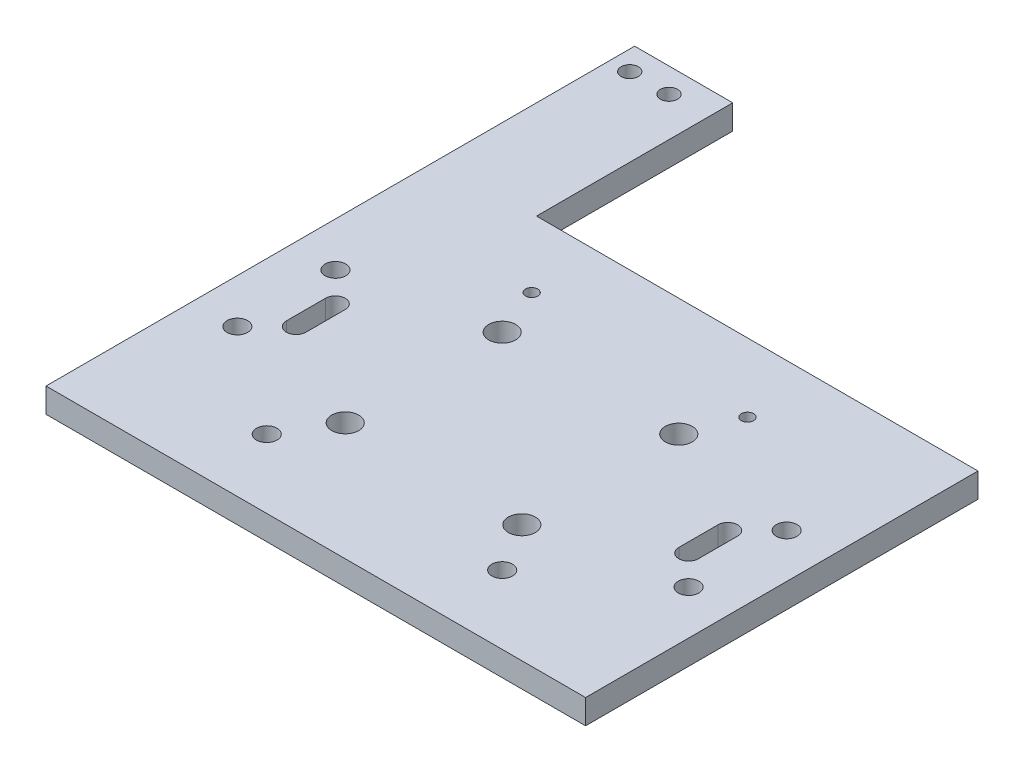
ISO-10303-21;
HEADER;
FILE_DESCRIPTION(('STEP AP214'),'2;1');
FILE_NAME('part.step','',(''),(''),'','','');
FILE_SCHEMA(('AUTOMOTIVE_DESIGN { 1 0 10303 214 1 1 1 1 }'));
ENDSEC;
DATA;
#1=APPLICATION_CONTEXT('core data for automotive mechanical design processes');
#2=APPLICATION_PROTOCOL_DEFINITION('international standard','automotive_design',2000,#1);
#3=PRODUCT_CONTEXT('',#1,'mechanical');
#4=PRODUCT('Part','Part','',(#3));
#5=PRODUCT_RELATED_PRODUCT_CATEGORY('part','',(#4));
#6=PRODUCT_DEFINITION_FORMATION('','',#4);
#7=PRODUCT_DEFINITION_CONTEXT('part definition',#1,'design');
#8=PRODUCT_DEFINITION('design','',#6,#7);
#9=PRODUCT_DEFINITION_SHAPE('','',#8);
#10=(LENGTH_UNIT() NAMED_UNIT(*) SI_UNIT(.MILLI.,.METRE.));
#11=(NAMED_UNIT(*) PLANE_ANGLE_UNIT() SI_UNIT($,.RADIAN.));
#12=(NAMED_UNIT(*) SI_UNIT($,.STERADIAN.) SOLID_ANGLE_UNIT());
#13=UNCERTAINTY_MEASURE_WITH_UNIT(LENGTH_MEASURE(1.E-05),#10,'distance_accuracy_value','');
#14=(GEOMETRIC_REPRESENTATION_CONTEXT(3) GLOBAL_UNCERTAINTY_ASSIGNED_CONTEXT((#13)) GLOBAL_UNIT_ASSIGNED_CONTEXT((#10,
#11,#12)) REPRESENTATION_CONTEXT('',''));
#15=CARTESIAN_POINT('',(0.,0.,0.));
#16=DIRECTION('',(0.,0.,1.));
#17=DIRECTION('',(1.,0.,0.));
#18=AXIS2_PLACEMENT_3D('',#15,#16,#17);
#19=CARTESIAN_POINT('',(-55.,5.,-40.));
#20=DIRECTION('',(0.,0.,1.));
#21=DIRECTION('',(1.,0.,0.));
#22=AXIS2_PLACEMENT_3D('',#19,#20,#21);
#23=PLANE('',#22);
#24=DIRECTION('',(0.,-1.,0.));
#25=VECTOR('',#24,1.);
#26=CARTESIAN_POINT('',(-35.,49.7213595499958,-40.));
#27=LINE('',#26,#25);
#28=CARTESIAN_POINT('',(-35.,5.,-40.));
#29=VERTEX_POINT('',#28);
#30=CARTESIAN_POINT('',(-35.,0.,-40.));
#31=VERTEX_POINT('',#30);
#32=EDGE_CURVE('E56',#29,#31,#27,.T.);
#33=ORIENTED_EDGE('',*,*,#32,.F.);
#34=DIRECTION('',(-1.,0.,0.));
#35=VECTOR('',#34,1.);
#36=CARTESIAN_POINT('',(-55.,5.,-40.));
#37=LINE('',#36,#35);
#38=CARTESIAN_POINT('',(55.,5.,-40.));
#39=VERTEX_POINT('',#38);
#40=EDGE_CURVE('E313',#39,#29,#37,.T.);
#41=ORIENTED_EDGE('',*,*,#40,.F.);
#42=DIRECTION('',(0.,-1.,0.));
#43=VECTOR('',#42,1.);
#44=CARTESIAN_POINT('',(55.,5.,-40.));
#45=LINE('',#44,#43);
#46=CARTESIAN_POINT('',(55.,0.,-40.));
#47=VERTEX_POINT('',#46);
#48=EDGE_CURVE('E11',#39,#47,#45,.T.);
#49=ORIENTED_EDGE('',*,*,#48,.T.);
#50=DIRECTION('',(-1.,0.,0.));
#51=VECTOR('',#50,1.);
#52=CARTESIAN_POINT('',(-55.,0.,-40.));
#53=LINE('',#52,#51);
#54=EDGE_CURVE('E139',#47,#31,#53,.T.);
#55=ORIENTED_EDGE('',*,*,#54,.T.);
#56=EDGE_LOOP('',(#33,#41,#49,#55));
#57=FACE_BOUND('',#56,.T.);
#58=ADVANCED_FACE('F41',(#57),#23,.F.);
#59=CARTESIAN_POINT('',(0.,5.,0.));
#60=DIRECTION('',(0.,-1.,0.));
#61=DIRECTION('',(0.,0.,-1.));
#62=AXIS2_PLACEMENT_3D('',#59,#60,#61);
#63=PLANE('',#62);
#64=CARTESIAN_POINT('',(-51.,5.00000000000003,-75.));
#65=DIRECTION('',(0.,1.,0.));
#66=DIRECTION('',(0.,0.,1.));
#67=AXIS2_PLACEMENT_3D('',#64,#65,#66);
#68=CIRCLE('',#67,1.75);
#69=CARTESIAN_POINT('',(-51.,5.00000000000003,-73.25));
#70=VERTEX_POINT('',#69);
#71=EDGE_CURVE('E163',#70,#70,#68,.T.);
#72=ORIENTED_EDGE('',*,*,#71,.F.);
#73=EDGE_LOOP('',(#72));
#74=FACE_BOUND('',#73,.T.);
#75=CARTESIAN_POINT('',(-43.,5.00000000000003,-75.));
#76=DIRECTION('',(0.,1.,0.));
#77=DIRECTION('',(0.,0.,1.));
#78=AXIS2_PLACEMENT_3D('',#75,#76,#77);
#79=CIRCLE('',#78,1.75);
#80=CARTESIAN_POINT('',(-43.,5.00000000000003,-73.25));
#81=VERTEX_POINT('',#80);
#82=EDGE_CURVE('E345',#81,#81,#79,.T.);
#83=ORIENTED_EDGE('',*,*,#82,.F.);
#84=EDGE_LOOP('',(#83));
#85=FACE_BOUND('',#84,.T.);
#86=CARTESIAN_POINT('',(-46.,5.,9.99999999999999));
#87=DIRECTION('',(0.,1.,0.));
#88=DIRECTION('',(0.,0.,1.));
#89=AXIS2_PLACEMENT_3D('',#86,#87,#88);
#90=CIRCLE('',#89,2.1);
#91=CARTESIAN_POINT('',(-46.,5.,12.1));
#92=VERTEX_POINT('',#91);
#93=EDGE_CURVE('E209',#92,#92,#90,.T.);
#94=ORIENTED_EDGE('',*,*,#93,.F.);
#95=EDGE_LOOP('',(#94));
#96=FACE_BOUND('',#95,.T.);
#97=CARTESIAN_POINT('',(46.,5.,9.99999999999997));
#98=DIRECTION('',(0.,1.,0.));
#99=DIRECTION('',(0.,0.,1.));
#100=AXIS2_PLACEMENT_3D('',#97,#98,#99);
#101=CIRCLE('',#100,2.1);
#102=CARTESIAN_POINT('',(46.,5.,12.1));
#103=VERTEX_POINT('',#102);
#104=EDGE_CURVE('E216',#103,#103,#101,.T.);
#105=ORIENTED_EDGE('',*,*,#104,.F.);
#106=EDGE_LOOP('',(#105));
#107=FACE_BOUND('',#106,.T.);
#108=CARTESIAN_POINT('',(46.,5.,-10.));
#109=DIRECTION('',(0.,1.,0.));
#110=DIRECTION('',(0.,0.,1.));
#111=AXIS2_PLACEMENT_3D('',#108,#109,#110);
#112=CIRCLE('',#111,2.1);
#113=CARTESIAN_POINT('',(46.,5.,-7.90000000000001));
#114=VERTEX_POINT('',#113);
#115=EDGE_CURVE('E222',#114,#114,#112,.T.);
#116=ORIENTED_EDGE('',*,*,#115,.F.);
#117=EDGE_LOOP('',(#116));
#118=FACE_BOUND('',#117,.T.);
#119=DIRECTION('',(0.,0.,1.));
#120=VECTOR('',#119,1.);
#121=CARTESIAN_POINT('',(-42.,5.,-4.));
#122=LINE('',#121,#120);
#123=CARTESIAN_POINT('',(-42.,5.,-4.));
#124=VERTEX_POINT('',#123);
#125=CARTESIAN_POINT('',(-42.,5.,4.00000000000002));
#126=VERTEX_POINT('',#125);
#127=EDGE_CURVE('E243',#124,#126,#122,.T.);
#128=ORIENTED_EDGE('',*,*,#127,.F.);
#129=CARTESIAN_POINT('',(-40.,5.,-4.));
#130=DIRECTION('',(0.,1.,0.));
#131=DIRECTION('',(0.,0.,1.));
#132=AXIS2_PLACEMENT_3D('',#129,#130,#131);
#133=CIRCLE('',#132,2.00000000000001);
#134=CARTESIAN_POINT('',(-38.,5.,-4.00000000000001));
#135=VERTEX_POINT('',#134);
#136=EDGE_CURVE('E64',#135,#124,#133,.T.);
#137=ORIENTED_EDGE('',*,*,#136,.F.);
#138=DIRECTION('',(0.,0.,-1.));
#139=VECTOR('',#138,1.);
#140=CARTESIAN_POINT('',(-38.,5.,-4.00000000000001));
#141=LINE('',#140,#139);
#142=CARTESIAN_POINT('',(-38.,5.,4.00000000000002));
#143=VERTEX_POINT('',#142);
#144=EDGE_CURVE('E236',#143,#135,#141,.T.);
#145=ORIENTED_EDGE('',*,*,#144,.F.);
#146=CARTESIAN_POINT('',(-40.,5.,4.00000000000002));
#147=DIRECTION('',(0.,1.,0.));
#148=DIRECTION('',(0.,0.,1.));
#149=AXIS2_PLACEMENT_3D('',#146,#147,#148);
#150=CIRCLE('',#149,2.00000000000001);
#151=EDGE_CURVE('E239',#126,#143,#150,.T.);
#152=ORIENTED_EDGE('',*,*,#151,.F.);
#153=EDGE_LOOP('',(#128,#137,#145,#152));
#154=FACE_BOUND('',#153,.T.);
#155=DIRECTION('',(0.,0.,1.));
#156=VECTOR('',#155,1.);
#157=CARTESIAN_POINT('',(38.,5.,-4.));
#158=LINE('',#157,#156);
#159=CARTESIAN_POINT('',(38.,5.,-4.));
#160=VERTEX_POINT('',#159);
#161=CARTESIAN_POINT('',(38.,5.,4.));
#162=VERTEX_POINT('',#161);
#163=EDGE_CURVE('E193',#160,#162,#158,.T.);
#164=ORIENTED_EDGE('',*,*,#163,.F.);
#165=CARTESIAN_POINT('',(40.,5.,-3.99999999999998));
#166=DIRECTION('',(0.,1.,0.));
#167=DIRECTION('',(0.,0.,1.));
#168=AXIS2_PLACEMENT_3D('',#165,#166,#167);
#169=CIRCLE('',#168,2.);
#170=CARTESIAN_POINT('',(42.,5.,-4.));
#171=VERTEX_POINT('',#170);
#172=EDGE_CURVE('E196',#171,#160,#169,.T.);
#173=ORIENTED_EDGE('',*,*,#172,.F.);
#174=DIRECTION('',(0.,0.,-1.));
#175=VECTOR('',#174,1.);
#176=CARTESIAN_POINT('',(42.,5.,-4.));
#177=LINE('',#176,#175);
#178=CARTESIAN_POINT('',(42.,5.00000000000006,3.99999999999998));
#179=VERTEX_POINT('',#178);
#180=EDGE_CURVE('E186',#179,#171,#177,.T.);
#181=ORIENTED_EDGE('',*,*,#180,.F.);
#182=CARTESIAN_POINT('',(40.,5.,4.));
#183=DIRECTION('',(0.,1.,0.));
#184=DIRECTION('',(0.,0.,1.));
#185=AXIS2_PLACEMENT_3D('',#182,#183,#184);
#186=CIRCLE('',#185,2.);
#187=EDGE_CURVE('E189',#162,#179,#186,.T.);
#188=ORIENTED_EDGE('',*,*,#187,.F.);
#189=EDGE_LOOP('',(#164,#173,#181,#188));
#190=FACE_BOUND('',#189,.T.);
#191=CARTESIAN_POINT('',(-46.,5.,-9.99999999999999));
#192=DIRECTION('',(0.,1.,0.));
#193=DIRECTION('',(0.,0.,1.));
#194=AXIS2_PLACEMENT_3D('',#191,#192,#193);
#195=CIRCLE('',#194,2.1);
#196=CARTESIAN_POINT('',(-46.,5.,-7.9));
#197=VERTEX_POINT('',#196);
#198=EDGE_CURVE('E212',#197,#197,#195,.T.);
#199=ORIENTED_EDGE('',*,*,#198,.F.);
#200=EDGE_LOOP('',(#199));
#201=FACE_BOUND('',#200,.T.);
#202=DIRECTION('',(0.,0.,-1.));
#203=VECTOR('',#202,1.);
#204=CARTESIAN_POINT('',(55.,5.,40.));
#205=LINE('',#204,#203);
#206=CARTESIAN_POINT('',(55.,5.,40.));
#207=VERTEX_POINT('',#206);
#208=EDGE_CURVE('E310',#207,#39,#205,.T.);
#209=ORIENTED_EDGE('',*,*,#208,.T.);
#210=ORIENTED_EDGE('',*,*,#40,.T.);
#211=DIRECTION('',(0.,0.,1.));
#212=VECTOR('',#211,1.);
#213=CARTESIAN_POINT('',(-35.,5.,-80.));
#214=LINE('',#213,#212);
#215=CARTESIAN_POINT('',(-35.,5.,-80.));
#216=VERTEX_POINT('',#215);
#217=EDGE_CURVE('E155',#216,#29,#214,.T.);
#218=ORIENTED_EDGE('',*,*,#217,.F.);
#219=DIRECTION('',(1.,0.,0.));
#220=VECTOR('',#219,1.);
#221=CARTESIAN_POINT('',(-55.,5.,-80.));
#222=LINE('',#221,#220);
#223=CARTESIAN_POINT('',(-55.,5.,-80.));
#224=VERTEX_POINT('',#223);
#225=EDGE_CURVE('E156',#224,#216,#222,.T.);
#226=ORIENTED_EDGE('',*,*,#225,.F.);
#227=DIRECTION('',(0.,0.,1.));
#228=VECTOR('',#227,1.);
#229=CARTESIAN_POINT('',(-55.,5.,40.));
#230=LINE('',#229,#228);
#231=CARTESIAN_POINT('',(-55.,5.,40.));
#232=VERTEX_POINT('',#231);
#233=EDGE_CURVE('E316',#224,#232,#230,.T.);
#234=ORIENTED_EDGE('',*,*,#233,.T.);
#235=DIRECTION('',(1.,0.,0.));
#236=VECTOR('',#235,1.);
#237=CARTESIAN_POINT('',(-55.,5.,40.));
#238=LINE('',#237,#236);
#239=EDGE_CURVE('E318',#232,#207,#238,.T.);
#240=ORIENTED_EDGE('',*,*,#239,.T.);
#241=EDGE_LOOP('',(#209,#210,#218,#226,#234,#240));
#242=FACE_BOUND('',#241,.T.);
#243=CARTESIAN_POINT('',(-18.,5.,-16.));
#244=DIRECTION('',(0.,1.,0.));
#245=DIRECTION('',(0.,0.,1.));
#246=AXIS2_PLACEMENT_3D('',#243,#244,#245);
#247=CIRCLE('',#246,2.75);
#248=CARTESIAN_POINT('',(-18.,5.,-13.25));
#249=VERTEX_POINT('',#248);
#250=EDGE_CURVE('E305',#249,#249,#247,.T.);
#251=ORIENTED_EDGE('',*,*,#250,.F.);
#252=EDGE_LOOP('',(#251));
#253=FACE_BOUND('',#252,.T.);
#254=CARTESIAN_POINT('',(18.,5.,-16.));
#255=DIRECTION('',(0.,1.,0.));
#256=DIRECTION('',(0.,0.,1.));
#257=AXIS2_PLACEMENT_3D('',#254,#255,#256);
#258=CIRCLE('',#257,2.75);
#259=CARTESIAN_POINT('',(18.,5.,-13.25));
#260=VERTEX_POINT('',#259);
#261=EDGE_CURVE('E299',#260,#260,#258,.T.);
#262=ORIENTED_EDGE('',*,*,#261,.F.);
#263=EDGE_LOOP('',(#262));
#264=FACE_BOUND('',#263,.T.);
#265=CARTESIAN_POINT('',(18.,4.99999999999998,16.));
#266=DIRECTION('',(0.,1.,0.));
#267=DIRECTION('',(0.,0.,1.));
#268=AXIS2_PLACEMENT_3D('',#265,#266,#267);
#269=CIRCLE('',#268,2.75);
#270=CARTESIAN_POINT('',(18.,4.99999999999998,18.75));
#271=VERTEX_POINT('',#270);
#272=EDGE_CURVE('E293',#271,#271,#269,.T.);
#273=ORIENTED_EDGE('',*,*,#272,.F.);
#274=EDGE_LOOP('',(#273));
#275=FACE_BOUND('',#274,.T.);
#276=CARTESIAN_POINT('',(-18.,5.,16.));
#277=DIRECTION('',(0.,1.,0.));
#278=DIRECTION('',(0.,0.,1.));
#279=AXIS2_PLACEMENT_3D('',#276,#277,#278);
#280=CIRCLE('',#279,2.75);
#281=CARTESIAN_POINT('',(-18.,5.,18.75));
#282=VERTEX_POINT('',#281);
#283=EDGE_CURVE('E287',#282,#282,#280,.T.);
#284=ORIENTED_EDGE('',*,*,#283,.F.);
#285=EDGE_LOOP('',(#284));
#286=FACE_BOUND('',#285,.T.);
#287=CARTESIAN_POINT('',(-22.,5.,-26.));
#288=DIRECTION('',(0.,1.,0.));
#289=DIRECTION('',(0.,0.,1.));
#290=AXIS2_PLACEMENT_3D('',#287,#288,#289);
#291=CIRCLE('',#290,1.25);
#292=CARTESIAN_POINT('',(-22.,5.,-24.75));
#293=VERTEX_POINT('',#292);
#294=EDGE_CURVE('E281',#293,#293,#291,.T.);
#295=ORIENTED_EDGE('',*,*,#294,.F.);
#296=EDGE_LOOP('',(#295));
#297=FACE_BOUND('',#296,.T.);
#298=CARTESIAN_POINT('',(22.,5.,-26.));
#299=DIRECTION('',(0.,1.,0.));
#300=DIRECTION('',(0.,0.,1.));
#301=AXIS2_PLACEMENT_3D('',#298,#299,#300);
#302=CIRCLE('',#301,1.25);
#303=CARTESIAN_POINT('',(22.,5.,-24.75));
#304=VERTEX_POINT('',#303);
#305=EDGE_CURVE('E275',#304,#304,#302,.T.);
#306=ORIENTED_EDGE('',*,*,#305,.F.);
#307=EDGE_LOOP('',(#306));
#308=FACE_BOUND('',#307,.T.);
#309=CARTESIAN_POINT('',(-24.,5.,26.));
#310=DIRECTION('',(0.,1.,0.));
#311=DIRECTION('',(0.,0.,1.));
#312=AXIS2_PLACEMENT_3D('',#309,#310,#311);
#313=CIRCLE('',#312,2.1);
#314=CARTESIAN_POINT('',(-24.,5.,28.1));
#315=VERTEX_POINT('',#314);
#316=EDGE_CURVE('E269',#315,#315,#313,.T.);
#317=ORIENTED_EDGE('',*,*,#316,.F.);
#318=EDGE_LOOP('',(#317));
#319=FACE_BOUND('',#318,.T.);
#320=CARTESIAN_POINT('',(24.,5.,26.));
#321=DIRECTION('',(0.,1.,0.));
#322=DIRECTION('',(0.,0.,1.));
#323=AXIS2_PLACEMENT_3D('',#320,#321,#322);
#324=CIRCLE('',#323,2.1);
#325=CARTESIAN_POINT('',(24.,5.,28.1));
#326=VERTEX_POINT('',#325);
#327=EDGE_CURVE('E263',#326,#326,#324,.T.);
#328=ORIENTED_EDGE('',*,*,#327,.F.);
#329=EDGE_LOOP('',(#328));
#330=FACE_BOUND('',#329,.T.);
#331=ADVANCED_FACE('F336',(#74,#85,#96,#107,#118,#154,#190,#201,#242,#253,#264,#275,#286,#297,
#308,#319,#330),#63,.F.);
#332=CARTESIAN_POINT('',(0.,0.,0.));
#333=DIRECTION('',(0.,-1.,0.));
#334=DIRECTION('',(0.,0.,-1.));
#335=AXIS2_PLACEMENT_3D('',#332,#333,#334);
#336=PLANE('',#335);
#337=CARTESIAN_POINT('',(-51.,0.,-75.));
#338=DIRECTION('',(0.,-1.,0.));
#339=DIRECTION('',(0.,0.,-1.));
#340=AXIS2_PLACEMENT_3D('',#337,#338,#339);
#341=CIRCLE('',#340,1.75);
#342=CARTESIAN_POINT('',(-51.,0.,-76.75));
#343=VERTEX_POINT('',#342);
#344=EDGE_CURVE('E168',#343,#343,#341,.F.);
#345=ORIENTED_EDGE('',*,*,#344,.T.);
#346=EDGE_LOOP('',(#345));
#347=FACE_BOUND('',#346,.T.);
#348=CARTESIAN_POINT('',(-43.,0.,-75.));
#349=DIRECTION('',(0.,-1.,0.));
#350=DIRECTION('',(0.,0.,-1.));
#351=AXIS2_PLACEMENT_3D('',#348,#349,#350);
#352=CIRCLE('',#351,1.75);
#353=CARTESIAN_POINT('',(-43.,0.,-76.75));
#354=VERTEX_POINT('',#353);
#355=EDGE_CURVE('E348',#354,#354,#352,.F.);
#356=ORIENTED_EDGE('',*,*,#355,.T.);
#357=EDGE_LOOP('',(#356));
#358=FACE_BOUND('',#357,.T.);
#359=CARTESIAN_POINT('',(-46.,0.,9.99999999999999));
#360=DIRECTION('',(0.,1.,0.));
#361=DIRECTION('',(0.,0.,1.));
#362=AXIS2_PLACEMENT_3D('',#359,#360,#361);
#363=CIRCLE('',#362,2.1);
#364=CARTESIAN_POINT('',(-46.,0.,12.1));
#365=VERTEX_POINT('',#364);
#366=EDGE_CURVE('E213',#365,#365,#363,.T.);
#367=ORIENTED_EDGE('',*,*,#366,.T.);
#368=EDGE_LOOP('',(#367));
#369=FACE_BOUND('',#368,.T.);
#370=CARTESIAN_POINT('',(46.,0.,10.));
#371=DIRECTION('',(0.,1.,0.));
#372=DIRECTION('',(0.,0.,1.));
#373=AXIS2_PLACEMENT_3D('',#370,#371,#372);
#374=CIRCLE('',#373,2.1);
#375=CARTESIAN_POINT('',(46.,0.,12.1));
#376=VERTEX_POINT('',#375);
#377=EDGE_CURVE('E219',#376,#376,#374,.T.);
#378=ORIENTED_EDGE('',*,*,#377,.T.);
#379=EDGE_LOOP('',(#378));
#380=FACE_BOUND('',#379,.T.);
#381=CARTESIAN_POINT('',(46.,0.,-10.));
#382=DIRECTION('',(0.,1.,0.));
#383=DIRECTION('',(0.,0.,1.));
#384=AXIS2_PLACEMENT_3D('',#381,#382,#383);
#385=CIRCLE('',#384,2.1);
#386=CARTESIAN_POINT('',(46.,0.,-7.90000000000001));
#387=VERTEX_POINT('',#386);
#388=EDGE_CURVE('E225',#387,#387,#385,.T.);
#389=ORIENTED_EDGE('',*,*,#388,.T.);
#390=EDGE_LOOP('',(#389));
#391=FACE_BOUND('',#390,.T.);
#392=CARTESIAN_POINT('',(-40.,0.,-4.));
#393=DIRECTION('',(0.,1.,0.));
#394=DIRECTION('',(0.,0.,1.));
#395=AXIS2_PLACEMENT_3D('',#392,#393,#394);
#396=CIRCLE('',#395,2.00000000000001);
#397=CARTESIAN_POINT('',(-38.,0.,-3.99999999999999));
#398=VERTEX_POINT('',#397);
#399=CARTESIAN_POINT('',(-42.,0.,-4.00000000000001));
#400=VERTEX_POINT('',#399);
#401=EDGE_CURVE('E240',#398,#400,#396,.T.);
#402=ORIENTED_EDGE('',*,*,#401,.T.);
#403=DIRECTION('',(0.,0.,1.));
#404=VECTOR('',#403,1.);
#405=CARTESIAN_POINT('',(-42.,0.,-4.00000000000001));
#406=LINE('',#405,#404);
#407=CARTESIAN_POINT('',(-42.,0.,3.99999999999999));
#408=VERTEX_POINT('',#407);
#409=EDGE_CURVE('E252',#400,#408,#406,.T.);
#410=ORIENTED_EDGE('',*,*,#409,.T.);
#411=CARTESIAN_POINT('',(-40.,0.,3.99999999999999));
#412=DIRECTION('',(0.,1.,0.));
#413=DIRECTION('',(0.,0.,1.));
#414=AXIS2_PLACEMENT_3D('',#411,#412,#413);
#415=CIRCLE('',#414,2.00000000000001);
#416=CARTESIAN_POINT('',(-38.,0.,4.));
#417=VERTEX_POINT('',#416);
#418=EDGE_CURVE('E249',#408,#417,#415,.T.);
#419=ORIENTED_EDGE('',*,*,#418,.T.);
#420=DIRECTION('',(0.,0.,-1.));
#421=VECTOR('',#420,1.);
#422=CARTESIAN_POINT('',(-38.,0.,-3.99999999999999));
#423=LINE('',#422,#421);
#424=EDGE_CURVE('E230',#417,#398,#423,.T.);
#425=ORIENTED_EDGE('',*,*,#424,.T.);
#426=EDGE_LOOP('',(#402,#410,#419,#425));
#427=FACE_BOUND('',#426,.T.);
#428=CARTESIAN_POINT('',(40.,0.,-4.));
#429=DIRECTION('',(0.,1.,0.));
#430=DIRECTION('',(0.,0.,1.));
#431=AXIS2_PLACEMENT_3D('',#428,#429,#430);
#432=CIRCLE('',#431,2.);
#433=CARTESIAN_POINT('',(42.,0.,-4.00000000000003));
#434=VERTEX_POINT('',#433);
#435=CARTESIAN_POINT('',(38.,0.,-4.00000000000001));
#436=VERTEX_POINT('',#435);
#437=EDGE_CURVE('E190',#434,#436,#432,.T.);
#438=ORIENTED_EDGE('',*,*,#437,.T.);
#439=DIRECTION('',(0.,0.,1.));
#440=VECTOR('',#439,1.);
#441=CARTESIAN_POINT('',(38.,0.,-4.00000000000001));
#442=LINE('',#441,#440);
#443=CARTESIAN_POINT('',(38.,0.,3.99999999999999));
#444=VERTEX_POINT('',#443);
#445=EDGE_CURVE('E204',#436,#444,#442,.T.);
#446=ORIENTED_EDGE('',*,*,#445,.T.);
#447=CARTESIAN_POINT('',(40.,0.,3.99999999999999));
#448=DIRECTION('',(0.,1.,0.));
#449=DIRECTION('',(0.,0.,1.));
#450=AXIS2_PLACEMENT_3D('',#447,#448,#449);
#451=CIRCLE('',#450,2.);
#452=CARTESIAN_POINT('',(42.,0.,3.99999999999998));
#453=VERTEX_POINT('',#452);
#454=EDGE_CURVE('E201',#444,#453,#451,.T.);
#455=ORIENTED_EDGE('',*,*,#454,.T.);
#456=DIRECTION('',(0.,0.,-1.));
#457=VECTOR('',#456,1.);
#458=CARTESIAN_POINT('',(42.,0.,-4.00000000000003));
#459=LINE('',#458,#457);
#460=EDGE_CURVE('E179',#453,#434,#459,.T.);
#461=ORIENTED_EDGE('',*,*,#460,.T.);
#462=EDGE_LOOP('',(#438,#446,#455,#461));
#463=FACE_BOUND('',#462,.T.);
#464=CARTESIAN_POINT('',(-46.,0.,-9.99999999999999));
#465=DIRECTION('',(0.,1.,0.));
#466=DIRECTION('',(0.,0.,1.));
#467=AXIS2_PLACEMENT_3D('',#464,#465,#466);
#468=CIRCLE('',#467,2.1);
#469=CARTESIAN_POINT('',(-46.,0.,-7.9));
#470=VERTEX_POINT('',#469);
#471=EDGE_CURVE('E257',#470,#470,#468,.T.);
#472=ORIENTED_EDGE('',*,*,#471,.T.);
#473=EDGE_LOOP('',(#472));
#474=FACE_BOUND('',#473,.T.);
#475=CARTESIAN_POINT('',(-24.,0.,26.));
#476=DIRECTION('',(0.,1.,0.));
#477=DIRECTION('',(0.,0.,1.));
#478=AXIS2_PLACEMENT_3D('',#475,#476,#477);
#479=CIRCLE('',#478,2.1);
#480=CARTESIAN_POINT('',(-24.,0.,28.1));
#481=VERTEX_POINT('',#480);
#482=EDGE_CURVE('E266',#481,#481,#479,.T.);
#483=ORIENTED_EDGE('',*,*,#482,.T.);
#484=EDGE_LOOP('',(#483));
#485=FACE_BOUND('',#484,.T.);
#486=CARTESIAN_POINT('',(-22.,0.,-26.));
#487=DIRECTION('',(0.,1.,0.));
#488=DIRECTION('',(0.,0.,1.));
#489=AXIS2_PLACEMENT_3D('',#486,#487,#488);
#490=CIRCLE('',#489,1.25);
#491=CARTESIAN_POINT('',(-22.,0.,-24.75));
#492=VERTEX_POINT('',#491);
#493=EDGE_CURVE('E278',#492,#492,#490,.T.);
#494=ORIENTED_EDGE('',*,*,#493,.T.);
#495=EDGE_LOOP('',(#494));
#496=FACE_BOUND('',#495,.T.);
#497=CARTESIAN_POINT('',(18.,0.,16.));
#498=DIRECTION('',(0.,1.,0.));
#499=DIRECTION('',(0.,0.,1.));
#500=AXIS2_PLACEMENT_3D('',#497,#498,#499);
#501=CIRCLE('',#500,2.75);
#502=CARTESIAN_POINT('',(18.,0.,18.75));
#503=VERTEX_POINT('',#502);
#504=EDGE_CURVE('E290',#503,#503,#501,.T.);
#505=ORIENTED_EDGE('',*,*,#504,.T.);
#506=EDGE_LOOP('',(#505));
#507=FACE_BOUND('',#506,.T.);
#508=CARTESIAN_POINT('',(-18.,0.,-16.));
#509=DIRECTION('',(0.,1.,0.));
#510=DIRECTION('',(0.,0.,1.));
#511=AXIS2_PLACEMENT_3D('',#508,#509,#510);
#512=CIRCLE('',#511,2.75);
#513=CARTESIAN_POINT('',(-18.,0.,-13.25));
#514=VERTEX_POINT('',#513);
#515=EDGE_CURVE('E302',#514,#514,#512,.T.);
#516=ORIENTED_EDGE('',*,*,#515,.T.);
#517=EDGE_LOOP('',(#516));
#518=FACE_BOUND('',#517,.T.);
#519=DIRECTION('',(0.,0.,-1.));
#520=VECTOR('',#519,1.);
#521=CARTESIAN_POINT('',(55.,0.,40.));
#522=LINE('',#521,#520);
#523=CARTESIAN_POINT('',(55.,0.,40.));
#524=VERTEX_POINT('',#523);
#525=EDGE_CURVE('E146',#524,#47,#522,.T.);
#526=ORIENTED_EDGE('',*,*,#525,.F.);
#527=DIRECTION('',(1.,0.,0.));
#528=VECTOR('',#527,1.);
#529=CARTESIAN_POINT('',(-55.,0.,40.));
#530=LINE('',#529,#528);
#531=CARTESIAN_POINT('',(-55.,0.,40.));
#532=VERTEX_POINT('',#531);
#533=EDGE_CURVE('E314',#532,#524,#530,.T.);
#534=ORIENTED_EDGE('',*,*,#533,.F.);
#535=DIRECTION('',(0.,0.,1.));
#536=VECTOR('',#535,1.);
#537=CARTESIAN_POINT('',(-55.,0.,40.));
#538=LINE('',#537,#536);
#539=CARTESIAN_POINT('',(-55.,0.,-80.));
#540=VERTEX_POINT('',#539);
#541=EDGE_CURVE('E145',#540,#532,#538,.T.);
#542=ORIENTED_EDGE('',*,*,#541,.F.);
#543=DIRECTION('',(-1.,0.,0.));
#544=VECTOR('',#543,1.);
#545=CARTESIAN_POINT('',(-55.,0.,-80.));
#546=LINE('',#545,#544);
#547=CARTESIAN_POINT('',(-35.,0.,-80.));
#548=VERTEX_POINT('',#547);
#549=EDGE_CURVE('E162',#548,#540,#546,.T.);
#550=ORIENTED_EDGE('',*,*,#549,.F.);
#551=DIRECTION('',(0.,0.,-1.));
#552=VECTOR('',#551,1.);
#553=CARTESIAN_POINT('',(-35.,0.,-80.));
#554=LINE('',#553,#552);
#555=EDGE_CURVE('E153',#31,#548,#554,.T.);
#556=ORIENTED_EDGE('',*,*,#555,.F.);
#557=ORIENTED_EDGE('',*,*,#54,.F.);
#558=EDGE_LOOP('',(#526,#534,#542,#550,#556,#557));
#559=FACE_BOUND('',#558,.T.);
#560=CARTESIAN_POINT('',(18.,0.,-16.));
#561=DIRECTION('',(0.,1.,0.));
#562=DIRECTION('',(0.,0.,1.));
#563=AXIS2_PLACEMENT_3D('',#560,#561,#562);
#564=CIRCLE('',#563,2.75);
#565=CARTESIAN_POINT('',(18.,0.,-13.25));
#566=VERTEX_POINT('',#565);
#567=EDGE_CURVE('E296',#566,#566,#564,.T.);
#568=ORIENTED_EDGE('',*,*,#567,.T.);
#569=EDGE_LOOP('',(#568));
#570=FACE_BOUND('',#569,.T.);
#571=CARTESIAN_POINT('',(-18.,0.,16.));
#572=DIRECTION('',(0.,1.,0.));
#573=DIRECTION('',(0.,0.,1.));
#574=AXIS2_PLACEMENT_3D('',#571,#572,#573);
#575=CIRCLE('',#574,2.75);
#576=CARTESIAN_POINT('',(-18.,0.,18.75));
#577=VERTEX_POINT('',#576);
#578=EDGE_CURVE('E284',#577,#577,#575,.T.);
#579=ORIENTED_EDGE('',*,*,#578,.T.);
#580=EDGE_LOOP('',(#579));
#581=FACE_BOUND('',#580,.T.);
#582=CARTESIAN_POINT('',(22.,0.,-26.));
#583=DIRECTION('',(0.,1.,0.));
#584=DIRECTION('',(0.,0.,1.));
#585=AXIS2_PLACEMENT_3D('',#582,#583,#584);
#586=CIRCLE('',#585,1.25);
#587=CARTESIAN_POINT('',(22.,0.,-24.75));
#588=VERTEX_POINT('',#587);
#589=EDGE_CURVE('E272',#588,#588,#586,.T.);
#590=ORIENTED_EDGE('',*,*,#589,.T.);
#591=EDGE_LOOP('',(#590));
#592=FACE_BOUND('',#591,.T.);
#593=CARTESIAN_POINT('',(24.,0.,26.));
#594=DIRECTION('',(0.,1.,0.));
#595=DIRECTION('',(0.,0.,1.));
#596=AXIS2_PLACEMENT_3D('',#593,#594,#595);
#597=CIRCLE('',#596,2.1);
#598=CARTESIAN_POINT('',(24.,0.,28.1));
#599=VERTEX_POINT('',#598);
#600=EDGE_CURVE('E260',#599,#599,#597,.T.);
#601=ORIENTED_EDGE('',*,*,#600,.T.);
#602=EDGE_LOOP('',(#601));
#603=FACE_BOUND('',#602,.T.);
#604=ADVANCED_FACE('F159',(#347,#358,#369,#380,#391,#427,#463,#474,#485,#496,#507,#518,#559,
#570,#581,#592,#603),#336,.T.);
#605=CARTESIAN_POINT('',(55.,5.,40.));
#606=DIRECTION('',(-1.,0.,0.));
#607=DIRECTION('',(0.,0.,1.));
#608=AXIS2_PLACEMENT_3D('',#605,#606,#607);
#609=PLANE('',#608);
#610=ORIENTED_EDGE('',*,*,#525,.T.);
#611=ORIENTED_EDGE('',*,*,#48,.F.);
#612=ORIENTED_EDGE('',*,*,#208,.F.);
#613=DIRECTION('',(0.,-1.,0.));
#614=VECTOR('',#613,1.);
#615=CARTESIAN_POINT('',(55.,5.,40.));
#616=LINE('',#615,#614);
#617=EDGE_CURVE('E320',#207,#524,#616,.T.);
#618=ORIENTED_EDGE('',*,*,#617,.T.);
#619=EDGE_LOOP('',(#610,#611,#612,#618));
#620=FACE_BOUND('',#619,.T.);
#621=ADVANCED_FACE('F43',(#620),#609,.F.);
#622=CARTESIAN_POINT('',(-55.,5.,40.));
#623=DIRECTION('',(1.,0.,0.));
#624=DIRECTION('',(0.,0.,-1.));
#625=AXIS2_PLACEMENT_3D('',#622,#623,#624);
#626=PLANE('',#625);
#627=ORIENTED_EDGE('',*,*,#541,.T.);
#628=DIRECTION('',(0.,-1.,0.));
#629=VECTOR('',#628,1.);
#630=CARTESIAN_POINT('',(-55.,5.,40.));
#631=LINE('',#630,#629);
#632=EDGE_CURVE('E49',#232,#532,#631,.T.);
#633=ORIENTED_EDGE('',*,*,#632,.F.);
#634=ORIENTED_EDGE('',*,*,#233,.F.);
#635=DIRECTION('',(0.,-1.,0.));
#636=VECTOR('',#635,1.);
#637=CARTESIAN_POINT('',(-55.,49.7213595499958,-80.));
#638=LINE('',#637,#636);
#639=EDGE_CURVE('E165',#224,#540,#638,.T.);
#640=ORIENTED_EDGE('',*,*,#639,.T.);
#641=EDGE_LOOP('',(#627,#633,#634,#640));
#642=FACE_BOUND('',#641,.T.);
#643=ADVANCED_FACE('F341',(#642),#626,.F.);
#644=CARTESIAN_POINT('',(-55.,5.,40.));
#645=DIRECTION('',(0.,0.,-1.));
#646=DIRECTION('',(-1.,0.,0.));
#647=AXIS2_PLACEMENT_3D('',#644,#645,#646);
#648=PLANE('',#647);
#649=ORIENTED_EDGE('',*,*,#533,.T.);
#650=ORIENTED_EDGE('',*,*,#617,.F.);
#651=ORIENTED_EDGE('',*,*,#239,.F.);
#652=ORIENTED_EDGE('',*,*,#632,.T.);
#653=EDGE_LOOP('',(#649,#650,#651,#652));
#654=FACE_BOUND('',#653,.T.);
#655=ADVANCED_FACE('F330',(#654),#648,.F.);
#656=CARTESIAN_POINT('',(-18.,5.,-16.));
#657=DIRECTION('',(0.,-1.,0.));
#658=DIRECTION('',(0.,0.,-1.));
#659=AXIS2_PLACEMENT_3D('',#656,#657,#658);
#660=CYLINDRICAL_SURFACE('',#659,2.75);
#661=ORIENTED_EDGE('',*,*,#250,.T.);
#662=EDGE_LOOP('',(#661));
#663=FACE_BOUND('',#662,.T.);
#664=ORIENTED_EDGE('',*,*,#515,.F.);
#665=EDGE_LOOP('',(#664));
#666=FACE_BOUND('',#665,.T.);
#667=ADVANCED_FACE('F409',(#663,#666),#660,.F.);
#668=CARTESIAN_POINT('',(18.,5.,-16.));
#669=DIRECTION('',(0.,-1.,0.));
#670=DIRECTION('',(0.,0.,-1.));
#671=AXIS2_PLACEMENT_3D('',#668,#669,#670);
#672=CYLINDRICAL_SURFACE('',#671,2.75);
#673=ORIENTED_EDGE('',*,*,#261,.T.);
#674=EDGE_LOOP('',(#673));
#675=FACE_BOUND('',#674,.T.);
#676=ORIENTED_EDGE('',*,*,#567,.F.);
#677=EDGE_LOOP('',(#676));
#678=FACE_BOUND('',#677,.T.);
#679=ADVANCED_FACE('F414',(#675,#678),#672,.F.);
#680=CARTESIAN_POINT('',(18.,4.99999999999998,16.));
#681=DIRECTION('',(0.,-1.,0.));
#682=DIRECTION('',(0.,0.,-1.));
#683=AXIS2_PLACEMENT_3D('',#680,#681,#682);
#684=CYLINDRICAL_SURFACE('',#683,2.75);
#685=ORIENTED_EDGE('',*,*,#272,.T.);
#686=EDGE_LOOP('',(#685));
#687=FACE_BOUND('',#686,.T.);
#688=ORIENTED_EDGE('',*,*,#504,.F.);
#689=EDGE_LOOP('',(#688));
#690=FACE_BOUND('',#689,.T.);
#691=ADVANCED_FACE('F418',(#687,#690),#684,.F.);
#692=CARTESIAN_POINT('',(-18.,5.,16.));
#693=DIRECTION('',(0.,-1.,0.));
#694=DIRECTION('',(0.,0.,-1.));
#695=AXIS2_PLACEMENT_3D('',#692,#693,#694);
#696=CYLINDRICAL_SURFACE('',#695,2.75);
#697=ORIENTED_EDGE('',*,*,#283,.T.);
#698=EDGE_LOOP('',(#697));
#699=FACE_BOUND('',#698,.T.);
#700=ORIENTED_EDGE('',*,*,#578,.F.);
#701=EDGE_LOOP('',(#700));
#702=FACE_BOUND('',#701,.T.);
#703=ADVANCED_FACE('F422',(#699,#702),#696,.F.);
#704=CARTESIAN_POINT('',(-22.,5.,-26.));
#705=DIRECTION('',(0.,-1.,0.));
#706=DIRECTION('',(0.,0.,-1.));
#707=AXIS2_PLACEMENT_3D('',#704,#705,#706);
#708=CYLINDRICAL_SURFACE('',#707,1.25);
#709=ORIENTED_EDGE('',*,*,#294,.T.);
#710=EDGE_LOOP('',(#709));
#711=FACE_BOUND('',#710,.T.);
#712=ORIENTED_EDGE('',*,*,#493,.F.);
#713=EDGE_LOOP('',(#712));
#714=FACE_BOUND('',#713,.T.);
#715=ADVANCED_FACE('F426',(#711,#714),#708,.F.);
#716=CARTESIAN_POINT('',(22.,5.,-26.));
#717=DIRECTION('',(0.,-1.,0.));
#718=DIRECTION('',(0.,0.,-1.));
#719=AXIS2_PLACEMENT_3D('',#716,#717,#718);
#720=CYLINDRICAL_SURFACE('',#719,1.25);
#721=ORIENTED_EDGE('',*,*,#305,.T.);
#722=EDGE_LOOP('',(#721));
#723=FACE_BOUND('',#722,.T.);
#724=ORIENTED_EDGE('',*,*,#589,.F.);
#725=EDGE_LOOP('',(#724));
#726=FACE_BOUND('',#725,.T.);
#727=ADVANCED_FACE('F430',(#723,#726),#720,.F.);
#728=CARTESIAN_POINT('',(-24.,5.,26.));
#729=DIRECTION('',(0.,-1.,0.));
#730=DIRECTION('',(0.,0.,-1.));
#731=AXIS2_PLACEMENT_3D('',#728,#729,#730);
#732=CYLINDRICAL_SURFACE('',#731,2.1);
#733=ORIENTED_EDGE('',*,*,#316,.T.);
#734=EDGE_LOOP('',(#733));
#735=FACE_BOUND('',#734,.T.);
#736=ORIENTED_EDGE('',*,*,#482,.F.);
#737=EDGE_LOOP('',(#736));
#738=FACE_BOUND('',#737,.T.);
#739=ADVANCED_FACE('F396',(#735,#738),#732,.F.);
#740=CARTESIAN_POINT('',(24.,5.,26.));
#741=DIRECTION('',(0.,-1.,0.));
#742=DIRECTION('',(0.,0.,-1.));
#743=AXIS2_PLACEMENT_3D('',#740,#741,#742);
#744=CYLINDRICAL_SURFACE('',#743,2.1);
#745=ORIENTED_EDGE('',*,*,#327,.T.);
#746=EDGE_LOOP('',(#745));
#747=FACE_BOUND('',#746,.T.);
#748=ORIENTED_EDGE('',*,*,#600,.F.);
#749=EDGE_LOOP('',(#748));
#750=FACE_BOUND('',#749,.T.);
#751=ADVANCED_FACE('F386',(#747,#750),#744,.F.);
#752=CARTESIAN_POINT('',(-46.,0.,-9.99999999999999));
#753=DIRECTION('',(0.,1.,0.));
#754=DIRECTION('',(0.,0.,1.));
#755=AXIS2_PLACEMENT_3D('',#752,#753,#754);
#756=CYLINDRICAL_SURFACE('',#755,2.1);
#757=ORIENTED_EDGE('',*,*,#471,.F.);
#758=EDGE_LOOP('',(#757));
#759=FACE_BOUND('',#758,.T.);
#760=ORIENTED_EDGE('',*,*,#198,.T.);
#761=EDGE_LOOP('',(#760));
#762=FACE_BOUND('',#761,.T.);
#763=ADVANCED_FACE('F383',(#759,#762),#756,.F.);
#764=CARTESIAN_POINT('',(40.,0.,-4.));
#765=DIRECTION('',(0.,1.,0.));
#766=DIRECTION('',(0.,0.,1.));
#767=AXIS2_PLACEMENT_3D('',#764,#765,#766);
#768=CYLINDRICAL_SURFACE('',#767,2.);
#769=ORIENTED_EDGE('',*,*,#172,.T.);
#770=DIRECTION('',(0.,1.,0.));
#771=VECTOR('',#770,1.);
#772=CARTESIAN_POINT('',(38.,0.,-4.00000000000001));
#773=LINE('',#772,#771);
#774=EDGE_CURVE('E176',#436,#160,#773,.T.);
#775=ORIENTED_EDGE('',*,*,#774,.F.);
#776=ORIENTED_EDGE('',*,*,#437,.F.);
#777=DIRECTION('',(0.,1.,0.));
#778=VECTOR('',#777,1.);
#779=CARTESIAN_POINT('',(42.,0.,-4.00000000000003));
#780=LINE('',#779,#778);
#781=EDGE_CURVE('E184',#434,#171,#780,.T.);
#782=ORIENTED_EDGE('',*,*,#781,.T.);
#783=EDGE_LOOP('',(#769,#775,#776,#782));
#784=FACE_BOUND('',#783,.T.);
#785=ADVANCED_FACE('F385',(#784),#768,.F.);
#786=CARTESIAN_POINT('',(42.,0.,-4.00000000000003));
#787=DIRECTION('',(1.,0.,0.));
#788=DIRECTION('',(0.,0.,-1.));
#789=AXIS2_PLACEMENT_3D('',#786,#787,#788);
#790=PLANE('',#789);
#791=ORIENTED_EDGE('',*,*,#180,.T.);
#792=ORIENTED_EDGE('',*,*,#781,.F.);
#793=ORIENTED_EDGE('',*,*,#460,.F.);
#794=DIRECTION('',(0.,1.,0.));
#795=VECTOR('',#794,1.);
#796=CARTESIAN_POINT('',(42.,0.,3.99999999999998));
#797=LINE('',#796,#795);
#798=EDGE_CURVE('E182',#453,#179,#797,.T.);
#799=ORIENTED_EDGE('',*,*,#798,.T.);
#800=EDGE_LOOP('',(#791,#792,#793,#799));
#801=FACE_BOUND('',#800,.T.);
#802=ADVANCED_FACE('F393',(#801),#790,.F.);
#803=CARTESIAN_POINT('',(40.,0.,3.99999999999999));
#804=DIRECTION('',(0.,1.,0.));
#805=DIRECTION('',(0.,0.,1.));
#806=AXIS2_PLACEMENT_3D('',#803,#804,#805);
#807=CYLINDRICAL_SURFACE('',#806,2.);
#808=ORIENTED_EDGE('',*,*,#187,.T.);
#809=ORIENTED_EDGE('',*,*,#798,.F.);
#810=ORIENTED_EDGE('',*,*,#454,.F.);
#811=DIRECTION('',(0.,1.,0.));
#812=VECTOR('',#811,1.);
#813=CARTESIAN_POINT('',(38.,0.,3.99999999999999));
#814=LINE('',#813,#812);
#815=EDGE_CURVE('E180',#444,#162,#814,.T.);
#816=ORIENTED_EDGE('',*,*,#815,.T.);
#817=EDGE_LOOP('',(#808,#809,#810,#816));
#818=FACE_BOUND('',#817,.T.);
#819=ADVANCED_FACE('F485',(#818),#807,.F.);
#820=CARTESIAN_POINT('',(38.,0.,-4.00000000000001));
#821=DIRECTION('',(-1.,0.,0.));
#822=DIRECTION('',(0.,0.,1.));
#823=AXIS2_PLACEMENT_3D('',#820,#821,#822);
#824=PLANE('',#823);
#825=ORIENTED_EDGE('',*,*,#163,.T.);
#826=ORIENTED_EDGE('',*,*,#815,.F.);
#827=ORIENTED_EDGE('',*,*,#445,.F.);
#828=ORIENTED_EDGE('',*,*,#774,.T.);
#829=EDGE_LOOP('',(#825,#826,#827,#828));
#830=FACE_BOUND('',#829,.T.);
#831=ADVANCED_FACE('F495',(#830),#824,.F.);
#832=CARTESIAN_POINT('',(-40.,0.,-4.));
#833=DIRECTION('',(0.,1.,0.));
#834=DIRECTION('',(0.,0.,1.));
#835=AXIS2_PLACEMENT_3D('',#832,#833,#834);
#836=CYLINDRICAL_SURFACE('',#835,2.00000000000001);
#837=ORIENTED_EDGE('',*,*,#136,.T.);
#838=DIRECTION('',(0.,1.,0.));
#839=VECTOR('',#838,1.);
#840=CARTESIAN_POINT('',(-42.,0.,-4.00000000000001));
#841=LINE('',#840,#839);
#842=EDGE_CURVE('E228',#400,#124,#841,.T.);
#843=ORIENTED_EDGE('',*,*,#842,.F.);
#844=ORIENTED_EDGE('',*,*,#401,.F.);
#845=DIRECTION('',(0.,1.,0.));
#846=VECTOR('',#845,1.);
#847=CARTESIAN_POINT('',(-38.,0.,-3.99999999999999));
#848=LINE('',#847,#846);
#849=EDGE_CURVE('E198',#398,#135,#848,.T.);
#850=ORIENTED_EDGE('',*,*,#849,.T.);
#851=EDGE_LOOP('',(#837,#843,#844,#850));
#852=FACE_BOUND('',#851,.T.);
#853=ADVANCED_FACE('F505',(#852),#836,.F.);
#854=CARTESIAN_POINT('',(-38.,0.,-3.99999999999999));
#855=DIRECTION('',(1.,0.,0.));
#856=DIRECTION('',(0.,0.,-1.));
#857=AXIS2_PLACEMENT_3D('',#854,#855,#856);
#858=PLANE('',#857);
#859=ORIENTED_EDGE('',*,*,#144,.T.);
#860=ORIENTED_EDGE('',*,*,#849,.F.);
#861=ORIENTED_EDGE('',*,*,#424,.F.);
#862=DIRECTION('',(0.,1.,0.));
#863=VECTOR('',#862,1.);
#864=CARTESIAN_POINT('',(-38.,0.,4.));
#865=LINE('',#864,#863);
#866=EDGE_CURVE('E233',#417,#143,#865,.T.);
#867=ORIENTED_EDGE('',*,*,#866,.T.);
#868=EDGE_LOOP('',(#859,#860,#861,#867));
#869=FACE_BOUND('',#868,.T.);
#870=ADVANCED_FACE('F515',(#869),#858,.F.);
#871=CARTESIAN_POINT('',(-40.,0.,3.99999999999999));
#872=DIRECTION('',(0.,1.,0.));
#873=DIRECTION('',(0.,0.,1.));
#874=AXIS2_PLACEMENT_3D('',#871,#872,#873);
#875=CYLINDRICAL_SURFACE('',#874,2.00000000000001);
#876=ORIENTED_EDGE('',*,*,#151,.T.);
#877=ORIENTED_EDGE('',*,*,#866,.F.);
#878=ORIENTED_EDGE('',*,*,#418,.F.);
#879=DIRECTION('',(0.,1.,0.));
#880=VECTOR('',#879,1.);
#881=CARTESIAN_POINT('',(-42.,0.,3.99999999999999));
#882=LINE('',#881,#880);
#883=EDGE_CURVE('E231',#408,#126,#882,.T.);
#884=ORIENTED_EDGE('',*,*,#883,.T.);
#885=EDGE_LOOP('',(#876,#877,#878,#884));
#886=FACE_BOUND('',#885,.T.);
#887=ADVANCED_FACE('F524',(#886),#875,.F.);
#888=CARTESIAN_POINT('',(-42.,0.,-4.00000000000001));
#889=DIRECTION('',(-1.,0.,0.));
#890=DIRECTION('',(0.,0.,1.));
#891=AXIS2_PLACEMENT_3D('',#888,#889,#890);
#892=PLANE('',#891);
#893=ORIENTED_EDGE('',*,*,#127,.T.);
#894=ORIENTED_EDGE('',*,*,#883,.F.);
#895=ORIENTED_EDGE('',*,*,#409,.F.);
#896=ORIENTED_EDGE('',*,*,#842,.T.);
#897=EDGE_LOOP('',(#893,#894,#895,#896));
#898=FACE_BOUND('',#897,.T.);
#899=ADVANCED_FACE('F533',(#898),#892,.F.);
#900=CARTESIAN_POINT('',(46.,0.,-10.));
#901=DIRECTION('',(0.,1.,0.));
#902=DIRECTION('',(0.,0.,1.));
#903=AXIS2_PLACEMENT_3D('',#900,#901,#902);
#904=CYLINDRICAL_SURFACE('',#903,2.1);
#905=ORIENTED_EDGE('',*,*,#388,.F.);
#906=EDGE_LOOP('',(#905));
#907=FACE_BOUND('',#906,.T.);
#908=ORIENTED_EDGE('',*,*,#115,.T.);
#909=EDGE_LOOP('',(#908));
#910=FACE_BOUND('',#909,.T.);
#911=ADVANCED_FACE('F543',(#907,#910),#904,.F.);
#912=CARTESIAN_POINT('',(46.,0.,10.));
#913=DIRECTION('',(0.,1.,0.));
#914=DIRECTION('',(0.,0.,1.));
#915=AXIS2_PLACEMENT_3D('',#912,#913,#914);
#916=CYLINDRICAL_SURFACE('',#915,2.1);
#917=ORIENTED_EDGE('',*,*,#377,.F.);
#918=EDGE_LOOP('',(#917));
#919=FACE_BOUND('',#918,.T.);
#920=ORIENTED_EDGE('',*,*,#104,.T.);
#921=EDGE_LOOP('',(#920));
#922=FACE_BOUND('',#921,.T.);
#923=ADVANCED_FACE('F553',(#919,#922),#916,.F.);
#924=CARTESIAN_POINT('',(-46.,0.,9.99999999999999));
#925=DIRECTION('',(0.,1.,0.));
#926=DIRECTION('',(0.,0.,1.));
#927=AXIS2_PLACEMENT_3D('',#924,#925,#926);
#928=CYLINDRICAL_SURFACE('',#927,2.1);
#929=ORIENTED_EDGE('',*,*,#366,.F.);
#930=EDGE_LOOP('',(#929));
#931=FACE_BOUND('',#930,.T.);
#932=ORIENTED_EDGE('',*,*,#93,.T.);
#933=EDGE_LOOP('',(#932));
#934=FACE_BOUND('',#933,.T.);
#935=ADVANCED_FACE('F563',(#931,#934),#928,.F.);
#936=CARTESIAN_POINT('',(-55.,49.7213595499958,-80.));
#937=DIRECTION('',(0.,0.,1.));
#938=DIRECTION('',(1.,0.,0.));
#939=AXIS2_PLACEMENT_3D('',#936,#937,#938);
#940=PLANE('',#939);
#941=ORIENTED_EDGE('',*,*,#639,.F.);
#942=ORIENTED_EDGE('',*,*,#225,.T.);
#943=DIRECTION('',(0.,-1.,0.));
#944=VECTOR('',#943,1.);
#945=CARTESIAN_POINT('',(-35.,49.7213595499958,-80.));
#946=LINE('',#945,#944);
#947=EDGE_CURVE('E157',#216,#548,#946,.T.);
#948=ORIENTED_EDGE('',*,*,#947,.T.);
#949=ORIENTED_EDGE('',*,*,#549,.T.);
#950=EDGE_LOOP('',(#941,#942,#948,#949));
#951=FACE_BOUND('',#950,.T.);
#952=ADVANCED_FACE('F343',(#951),#940,.F.);
#953=CARTESIAN_POINT('',(-35.,49.7213595499958,-80.));
#954=DIRECTION('',(-1.,0.,0.));
#955=DIRECTION('',(0.,0.,1.));
#956=AXIS2_PLACEMENT_3D('',#953,#954,#955);
#957=PLANE('',#956);
#958=ORIENTED_EDGE('',*,*,#947,.F.);
#959=ORIENTED_EDGE('',*,*,#217,.T.);
#960=ORIENTED_EDGE('',*,*,#32,.T.);
#961=ORIENTED_EDGE('',*,*,#555,.T.);
#962=EDGE_LOOP('',(#958,#959,#960,#961));
#963=FACE_BOUND('',#962,.T.);
#964=ADVANCED_FACE('F152',(#963),#957,.F.);
#965=CARTESIAN_POINT('',(-43.,-0.001000000000001,-75.));
#966=DIRECTION('',(0.,1.,0.));
#967=DIRECTION('',(0.,0.,1.));
#968=AXIS2_PLACEMENT_3D('',#965,#966,#967);
#969=CYLINDRICAL_SURFACE('',#968,1.75);
#970=ORIENTED_EDGE('',*,*,#355,.F.);
#971=EDGE_LOOP('',(#970));
#972=FACE_BOUND('',#971,.T.);
#973=ORIENTED_EDGE('',*,*,#82,.T.);
#974=EDGE_LOOP('',(#973));
#975=FACE_BOUND('',#974,.T.);
#976=ADVANCED_FACE('F359',(#972,#975),#969,.F.);
#977=CARTESIAN_POINT('',(-51.,-0.001000000000001,-75.));
#978=DIRECTION('',(0.,1.,0.));
#979=DIRECTION('',(0.,0.,1.));
#980=AXIS2_PLACEMENT_3D('',#977,#978,#979);
#981=CYLINDRICAL_SURFACE('',#980,1.75);
#982=ORIENTED_EDGE('',*,*,#344,.F.);
#983=EDGE_LOOP('',(#982));
#984=FACE_BOUND('',#983,.T.);
#985=ORIENTED_EDGE('',*,*,#71,.T.);
#986=EDGE_LOOP('',(#985));
#987=FACE_BOUND('',#986,.T.);
#988=ADVANCED_FACE('F356',(#984,#987),#981,.F.);
#989=CLOSED_SHELL('',(#58,#331,#604,#621,#643,#655,#667,#679,#691,#703,#715,#727,#739,#751,#763,
#785,#802,#819,#831,#853,#870,#887,#899,#911,#923,#935,#952,#964,#976,#988));
#990=MANIFOLD_SOLID_BREP('B2',#989);
#991=ADVANCED_BREP_SHAPE_REPRESENTATION('',(#18,#990),#14);
#992=SHAPE_DEFINITION_REPRESENTATION(#9,#991);
ENDSEC;
END-ISO-10303-21;
